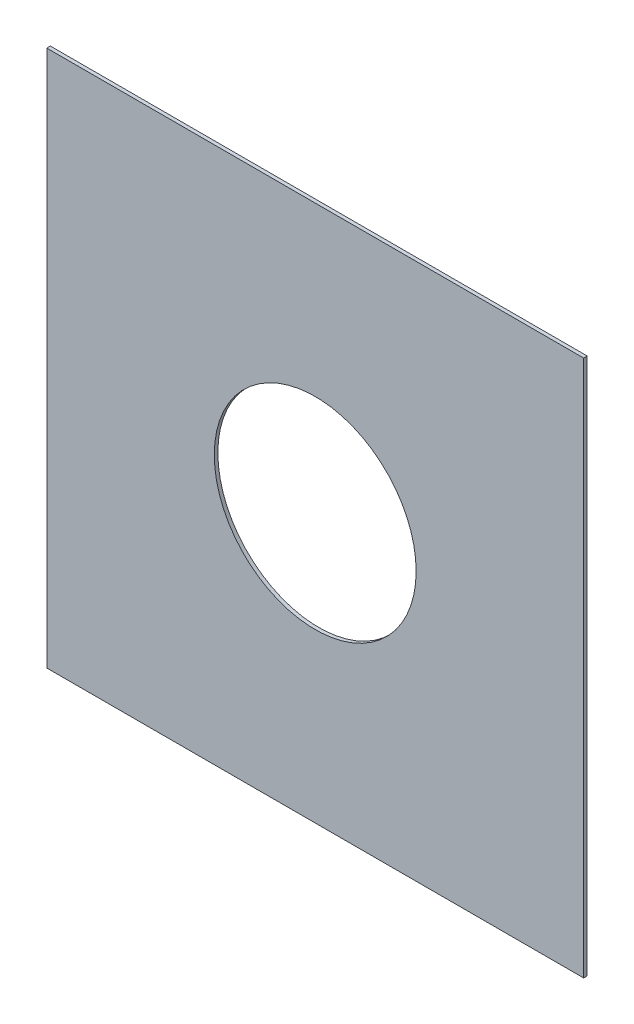
ISO-10303-21;
HEADER;
FILE_DESCRIPTION(('STEP AP214'),'2;1');
FILE_NAME('part.step','',(''),(''),'','','');
FILE_SCHEMA(('AUTOMOTIVE_DESIGN { 1 0 10303 214 1 1 1 1 }'));
ENDSEC;
DATA;
#1=APPLICATION_CONTEXT('core data for automotive mechanical design processes');
#2=APPLICATION_PROTOCOL_DEFINITION('international standard','automotive_design',2000,#1);
#3=PRODUCT_CONTEXT('',#1,'mechanical');
#4=PRODUCT('Part','Part','',(#3));
#5=PRODUCT_RELATED_PRODUCT_CATEGORY('part','',(#4));
#6=PRODUCT_DEFINITION_FORMATION('','',#4);
#7=PRODUCT_DEFINITION_CONTEXT('part definition',#1,'design');
#8=PRODUCT_DEFINITION('design','',#6,#7);
#9=PRODUCT_DEFINITION_SHAPE('','',#8);
#10=(LENGTH_UNIT() NAMED_UNIT(*) SI_UNIT(.MILLI.,.METRE.));
#11=(NAMED_UNIT(*) PLANE_ANGLE_UNIT() SI_UNIT($,.RADIAN.));
#12=(NAMED_UNIT(*) SI_UNIT($,.STERADIAN.) SOLID_ANGLE_UNIT());
#13=UNCERTAINTY_MEASURE_WITH_UNIT(LENGTH_MEASURE(1.E-05),#10,'distance_accuracy_value','');
#14=(GEOMETRIC_REPRESENTATION_CONTEXT(3) GLOBAL_UNCERTAINTY_ASSIGNED_CONTEXT((#13)) GLOBAL_UNIT_ASSIGNED_CONTEXT((#10,
#11,#12)) REPRESENTATION_CONTEXT('',''));
#15=CARTESIAN_POINT('',(0.,0.,0.));
#16=DIRECTION('',(0.,0.,1.));
#17=DIRECTION('',(1.,0.,0.));
#18=AXIS2_PLACEMENT_3D('',#15,#16,#17);
#19=CARTESIAN_POINT('',(-19.05,-19.05,0.254));
#20=DIRECTION('',(0.,0.,1.));
#21=DIRECTION('',(1.,0.,0.));
#22=AXIS2_PLACEMENT_3D('',#19,#20,#21);
#23=PLANE('',#22);
#24=DIRECTION('',(0.,-1.,0.));
#25=VECTOR('',#24,1.);
#26=CARTESIAN_POINT('',(-19.05,19.05,0.254));
#27=LINE('',#26,#25);
#28=CARTESIAN_POINT('',(-19.05,19.05,0.254));
#29=VERTEX_POINT('',#28);
#30=CARTESIAN_POINT('',(-19.05,-19.05,0.254));
#31=VERTEX_POINT('',#30);
#32=EDGE_CURVE('E88',#29,#31,#27,.T.);
#33=ORIENTED_EDGE('',*,*,#32,.T.);
#34=DIRECTION('',(1.,0.,0.));
#35=VECTOR('',#34,1.);
#36=CARTESIAN_POINT('',(-19.05,-19.05,0.254));
#37=LINE('',#36,#35);
#38=CARTESIAN_POINT('',(19.05,-19.05,0.254));
#39=VERTEX_POINT('',#38);
#40=EDGE_CURVE('E83',#31,#39,#37,.T.);
#41=ORIENTED_EDGE('',*,*,#40,.T.);
#42=DIRECTION('',(0.,1.,0.));
#43=VECTOR('',#42,1.);
#44=CARTESIAN_POINT('',(19.05,19.05,0.254));
#45=LINE('',#44,#43);
#46=CARTESIAN_POINT('',(19.05,19.05,0.254));
#47=VERTEX_POINT('',#46);
#48=EDGE_CURVE('E86',#39,#47,#45,.T.);
#49=ORIENTED_EDGE('',*,*,#48,.T.);
#50=DIRECTION('',(-1.,0.,0.));
#51=VECTOR('',#50,1.);
#52=CARTESIAN_POINT('',(-19.05,19.05,0.254));
#53=LINE('',#52,#51);
#54=EDGE_CURVE('E53',#47,#29,#53,.T.);
#55=ORIENTED_EDGE('',*,*,#54,.T.);
#56=EDGE_LOOP('',(#33,#41,#49,#55));
#57=FACE_BOUND('',#56,.T.);
#58=CARTESIAN_POINT('',(0.,0.,0.254));
#59=DIRECTION('',(0.,0.,1.));
#60=DIRECTION('',(1.,0.,0.));
#61=AXIS2_PLACEMENT_3D('',#58,#59,#60);
#62=CIRCLE('',#61,7.1628);
#63=CARTESIAN_POINT('',(7.1628,0.,0.254));
#64=VERTEX_POINT('',#63);
#65=EDGE_CURVE('E103',#64,#64,#62,.T.);
#66=ORIENTED_EDGE('',*,*,#65,.F.);
#67=EDGE_LOOP('',(#66));
#68=FACE_BOUND('',#67,.T.);
#69=ADVANCED_FACE('F36',(#57,#68),#23,.T.);
#70=CARTESIAN_POINT('',(-19.05,-19.05,0.));
#71=DIRECTION('',(0.,0.,1.));
#72=DIRECTION('',(1.,0.,0.));
#73=AXIS2_PLACEMENT_3D('',#70,#71,#72);
#74=PLANE('',#73);
#75=DIRECTION('',(0.,-1.,0.));
#76=VECTOR('',#75,1.);
#77=CARTESIAN_POINT('',(-19.05,19.05,0.));
#78=LINE('',#77,#76);
#79=CARTESIAN_POINT('',(-19.05,19.05,0.));
#80=VERTEX_POINT('',#79);
#81=CARTESIAN_POINT('',(-19.05,-19.05,0.));
#82=VERTEX_POINT('',#81);
#83=EDGE_CURVE('E100',#80,#82,#78,.T.);
#84=ORIENTED_EDGE('',*,*,#83,.F.);
#85=DIRECTION('',(-1.,0.,0.));
#86=VECTOR('',#85,1.);
#87=CARTESIAN_POINT('',(-19.05,19.05,0.));
#88=LINE('',#87,#86);
#89=CARTESIAN_POINT('',(19.05,19.05,0.));
#90=VERTEX_POINT('',#89);
#91=EDGE_CURVE('E76',#90,#80,#88,.T.);
#92=ORIENTED_EDGE('',*,*,#91,.F.);
#93=DIRECTION('',(0.,1.,0.));
#94=VECTOR('',#93,1.);
#95=CARTESIAN_POINT('',(19.05,19.05,0.));
#96=LINE('',#95,#94);
#97=CARTESIAN_POINT('',(19.05,-19.05,0.));
#98=VERTEX_POINT('',#97);
#99=EDGE_CURVE('E70',#98,#90,#96,.T.);
#100=ORIENTED_EDGE('',*,*,#99,.F.);
#101=DIRECTION('',(1.,0.,0.));
#102=VECTOR('',#101,1.);
#103=CARTESIAN_POINT('',(-19.05,-19.05,0.));
#104=LINE('',#103,#102);
#105=EDGE_CURVE('E92',#82,#98,#104,.T.);
#106=ORIENTED_EDGE('',*,*,#105,.F.);
#107=EDGE_LOOP('',(#84,#92,#100,#106));
#108=FACE_BOUND('',#107,.T.);
#109=CARTESIAN_POINT('',(0.,0.,0.));
#110=DIRECTION('',(0.,0.,1.));
#111=DIRECTION('',(1.,0.,0.));
#112=AXIS2_PLACEMENT_3D('',#109,#110,#111);
#113=CIRCLE('',#112,7.1628);
#114=CARTESIAN_POINT('',(7.1628,0.,0.));
#115=VERTEX_POINT('',#114);
#116=EDGE_CURVE('E115',#115,#115,#113,.T.);
#117=ORIENTED_EDGE('',*,*,#116,.T.);
#118=EDGE_LOOP('',(#117));
#119=FACE_BOUND('',#118,.T.);
#120=ADVANCED_FACE('F111',(#108,#119),#74,.F.);
#121=CARTESIAN_POINT('',(-19.05,19.05,0.254));
#122=DIRECTION('',(1.,0.,0.));
#123=DIRECTION('',(0.,1.,0.));
#124=AXIS2_PLACEMENT_3D('',#121,#122,#123);
#125=PLANE('',#124);
#126=ORIENTED_EDGE('',*,*,#83,.T.);
#127=DIRECTION('',(0.,0.,-1.));
#128=VECTOR('',#127,1.);
#129=CARTESIAN_POINT('',(-19.05,-19.05,0.254));
#130=LINE('',#129,#128);
#131=EDGE_CURVE('E11',#31,#82,#130,.T.);
#132=ORIENTED_EDGE('',*,*,#131,.F.);
#133=ORIENTED_EDGE('',*,*,#32,.F.);
#134=DIRECTION('',(0.,0.,-1.));
#135=VECTOR('',#134,1.);
#136=CARTESIAN_POINT('',(-19.05,19.05,0.254));
#137=LINE('',#136,#135);
#138=EDGE_CURVE('E96',#29,#80,#137,.T.);
#139=ORIENTED_EDGE('',*,*,#138,.T.);
#140=EDGE_LOOP('',(#126,#132,#133,#139));
#141=FACE_BOUND('',#140,.T.);
#142=ADVANCED_FACE('F38',(#141),#125,.F.);
#143=CARTESIAN_POINT('',(-19.05,-19.05,0.254));
#144=DIRECTION('',(0.,1.,0.));
#145=DIRECTION('',(0.,0.,1.));
#146=AXIS2_PLACEMENT_3D('',#143,#144,#145);
#147=PLANE('',#146);
#148=ORIENTED_EDGE('',*,*,#105,.T.);
#149=DIRECTION('',(0.,0.,-1.));
#150=VECTOR('',#149,1.);
#151=CARTESIAN_POINT('',(19.05,-19.05,0.254));
#152=LINE('',#151,#150);
#153=EDGE_CURVE('E45',#39,#98,#152,.T.);
#154=ORIENTED_EDGE('',*,*,#153,.F.);
#155=ORIENTED_EDGE('',*,*,#40,.F.);
#156=ORIENTED_EDGE('',*,*,#131,.T.);
#157=EDGE_LOOP('',(#148,#154,#155,#156));
#158=FACE_BOUND('',#157,.T.);
#159=ADVANCED_FACE('F91',(#158),#147,.F.);
#160=CARTESIAN_POINT('',(19.05,19.05,0.254));
#161=DIRECTION('',(-1.,0.,0.));
#162=DIRECTION('',(0.,-1.,0.));
#163=AXIS2_PLACEMENT_3D('',#160,#161,#162);
#164=PLANE('',#163);
#165=ORIENTED_EDGE('',*,*,#99,.T.);
#166=DIRECTION('',(0.,0.,-1.));
#167=VECTOR('',#166,1.);
#168=CARTESIAN_POINT('',(19.05,19.05,0.254));
#169=LINE('',#168,#167);
#170=EDGE_CURVE('E93',#47,#90,#169,.T.);
#171=ORIENTED_EDGE('',*,*,#170,.F.);
#172=ORIENTED_EDGE('',*,*,#48,.F.);
#173=ORIENTED_EDGE('',*,*,#153,.T.);
#174=EDGE_LOOP('',(#165,#171,#172,#173));
#175=FACE_BOUND('',#174,.T.);
#176=ADVANCED_FACE('F94',(#175),#164,.F.);
#177=CARTESIAN_POINT('',(-19.05,19.05,0.254));
#178=DIRECTION('',(0.,-1.,0.));
#179=DIRECTION('',(0.,0.,-1.));
#180=AXIS2_PLACEMENT_3D('',#177,#178,#179);
#181=PLANE('',#180);
#182=ORIENTED_EDGE('',*,*,#91,.T.);
#183=ORIENTED_EDGE('',*,*,#138,.F.);
#184=ORIENTED_EDGE('',*,*,#54,.F.);
#185=ORIENTED_EDGE('',*,*,#170,.T.);
#186=EDGE_LOOP('',(#182,#183,#184,#185));
#187=FACE_BOUND('',#186,.T.);
#188=ADVANCED_FACE('F108',(#187),#181,.F.);
#189=CARTESIAN_POINT('',(0.,0.,0.254));
#190=DIRECTION('',(0.,0.,-1.));
#191=DIRECTION('',(-1.,0.,0.));
#192=AXIS2_PLACEMENT_3D('',#189,#190,#191);
#193=CYLINDRICAL_SURFACE('',#192,7.1628);
#194=ORIENTED_EDGE('',*,*,#65,.T.);
#195=EDGE_LOOP('',(#194));
#196=FACE_BOUND('',#195,.T.);
#197=ORIENTED_EDGE('',*,*,#116,.F.);
#198=EDGE_LOOP('',(#197));
#199=FACE_BOUND('',#198,.T.);
#200=ADVANCED_FACE('F125',(#196,#199),#193,.F.);
#201=CLOSED_SHELL('',(#69,#120,#142,#159,#176,#188,#200));
#202=MANIFOLD_SOLID_BREP('B2',#201);
#203=ADVANCED_BREP_SHAPE_REPRESENTATION('',(#18,#202),#14);
#204=SHAPE_DEFINITION_REPRESENTATION(#9,#203);
ENDSEC;
END-ISO-10303-21;
